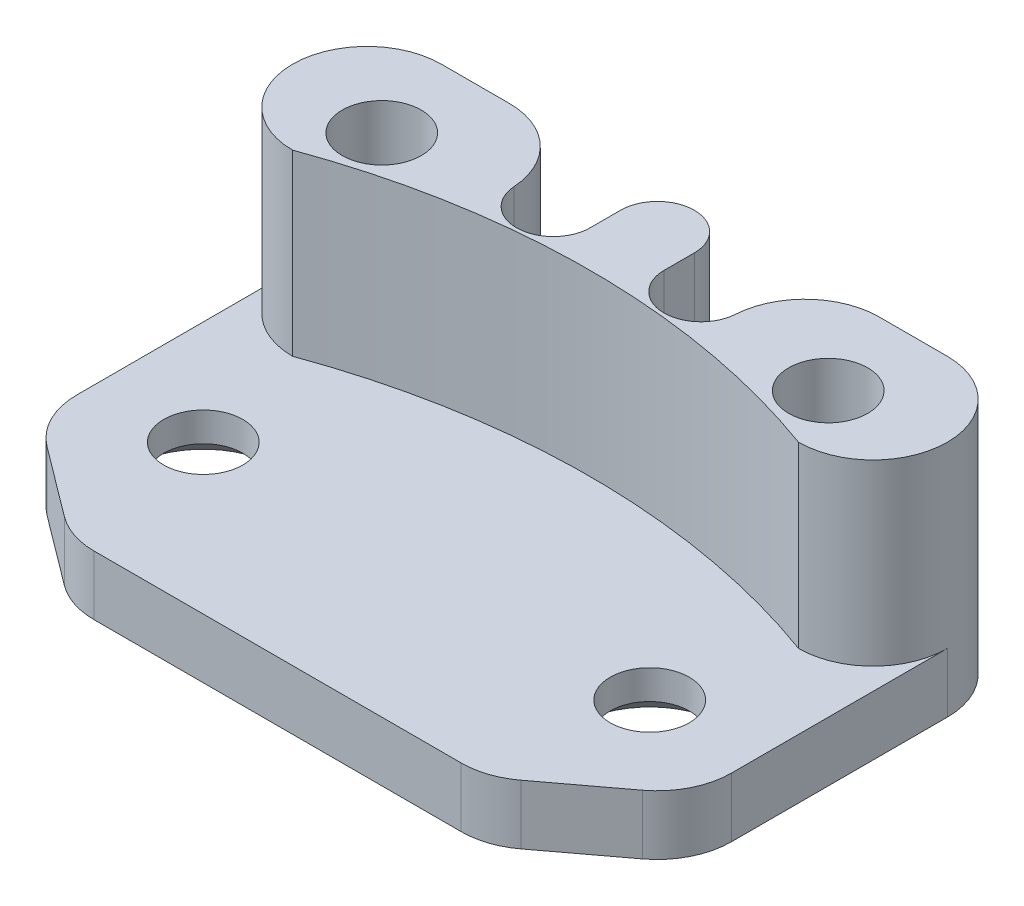
ISO-10303-21;
HEADER;
FILE_DESCRIPTION(('STEP AP214'),'2;1');
FILE_NAME('part.step','',(''),(''),'','','');
FILE_SCHEMA(('AUTOMOTIVE_DESIGN { 1 0 10303 214 1 1 1 1 }'));
ENDSEC;
DATA;
#1=APPLICATION_CONTEXT('core data for automotive mechanical design processes');
#2=APPLICATION_PROTOCOL_DEFINITION('international standard','automotive_design',2000,#1);
#3=PRODUCT_CONTEXT('',#1,'mechanical');
#4=PRODUCT('Part','Part','',(#3));
#5=PRODUCT_RELATED_PRODUCT_CATEGORY('part','',(#4));
#6=PRODUCT_DEFINITION_FORMATION('','',#4);
#7=PRODUCT_DEFINITION_CONTEXT('part definition',#1,'design');
#8=PRODUCT_DEFINITION('design','',#6,#7);
#9=PRODUCT_DEFINITION_SHAPE('','',#8);
#10=(LENGTH_UNIT() NAMED_UNIT(*) SI_UNIT(.MILLI.,.METRE.));
#11=(NAMED_UNIT(*) PLANE_ANGLE_UNIT() SI_UNIT($,.RADIAN.));
#12=(NAMED_UNIT(*) SI_UNIT($,.STERADIAN.) SOLID_ANGLE_UNIT());
#13=UNCERTAINTY_MEASURE_WITH_UNIT(LENGTH_MEASURE(1.E-05),#10,'distance_accuracy_value','');
#14=(GEOMETRIC_REPRESENTATION_CONTEXT(3) GLOBAL_UNCERTAINTY_ASSIGNED_CONTEXT((#13)) GLOBAL_UNIT_ASSIGNED_CONTEXT((#10,
#11,#12)) REPRESENTATION_CONTEXT('',''));
#15=CARTESIAN_POINT('',(0.,0.,0.));
#16=DIRECTION('',(0.,0.,1.));
#17=DIRECTION('',(1.,0.,0.));
#18=AXIS2_PLACEMENT_3D('',#15,#16,#17);
#19=CARTESIAN_POINT('',(-34.925,25.4,6.35));
#20=DIRECTION('',(1.,0.,0.));
#21=DIRECTION('',(0.,0.,-1.));
#22=AXIS2_PLACEMENT_3D('',#19,#20,#21);
#23=PLANE('',#22);
#24=DIRECTION('',(0.,0.,1.));
#25=VECTOR('',#24,1.);
#26=CARTESIAN_POINT('',(-34.925,6.35,-20.6375));
#27=LINE('',#26,#25);
#28=CARTESIAN_POINT('',(-34.925,6.35,-20.6375));
#29=VERTEX_POINT('',#28);
#30=CARTESIAN_POINT('',(-34.925,6.35,2.38125));
#31=VERTEX_POINT('',#30);
#32=EDGE_CURVE('E235',#29,#31,#27,.T.);
#33=ORIENTED_EDGE('',*,*,#32,.F.);
#34=DIRECTION('',(0.,-1.,0.));
#35=VECTOR('',#34,1.);
#36=CARTESIAN_POINT('',(-34.925,25.4,-20.6375));
#37=LINE('',#36,#35);
#38=CARTESIAN_POINT('',(-34.925,0.,-20.6375));
#39=VERTEX_POINT('',#38);
#40=EDGE_CURVE('E248',#29,#39,#37,.T.);
#41=ORIENTED_EDGE('',*,*,#40,.T.);
#42=DIRECTION('',(0.,0.,1.));
#43=VECTOR('',#42,1.);
#44=CARTESIAN_POINT('',(-34.925,0.,6.35));
#45=LINE('',#44,#43);
#46=CARTESIAN_POINT('',(-34.925,0.,2.38125));
#47=VERTEX_POINT('',#46);
#48=EDGE_CURVE('E292',#39,#47,#45,.T.);
#49=ORIENTED_EDGE('',*,*,#48,.T.);
#50=DIRECTION('',(0.,-1.,0.));
#51=VECTOR('',#50,1.);
#52=CARTESIAN_POINT('',(-34.925,25.4,2.38125));
#53=LINE('',#52,#51);
#54=EDGE_CURVE('E251',#47,#31,#53,.F.);
#55=ORIENTED_EDGE('',*,*,#54,.T.);
#56=EDGE_LOOP('',(#33,#41,#49,#55));
#57=FACE_BOUND('',#56,.T.);
#58=ADVANCED_FACE('F61',(#57),#23,.F.);
#59=CARTESIAN_POINT('',(-34.925,25.4,6.35));
#60=DIRECTION('',(0.6,0.,-0.8));
#61=DIRECTION('',(-0.8,0.,-0.6));
#62=AXIS2_PLACEMENT_3D('',#59,#60,#61);
#63=PLANE('',#62);
#64=DIRECTION('',(0.8,0.,0.6));
#65=VECTOR('',#64,1.);
#66=CARTESIAN_POINT('',(-31.75,6.35,8.73125));
#67=LINE('',#66,#65);
#68=CARTESIAN_POINT('',(-31.75,6.35,8.73125));
#69=VERTEX_POINT('',#68);
#70=CARTESIAN_POINT('',(-24.3416666666667,6.35,14.2875));
#71=VERTEX_POINT('',#70);
#72=EDGE_CURVE('E418',#69,#71,#67,.T.);
#73=ORIENTED_EDGE('',*,*,#72,.F.);
#74=DIRECTION('',(0.,-1.,0.));
#75=VECTOR('',#74,1.);
#76=CARTESIAN_POINT('',(-31.75,25.4,8.73125));
#77=LINE('',#76,#75);
#78=CARTESIAN_POINT('',(-31.75,0.,8.73125));
#79=VERTEX_POINT('',#78);
#80=EDGE_CURVE('E262',#69,#79,#77,.T.);
#81=ORIENTED_EDGE('',*,*,#80,.T.);
#82=DIRECTION('',(0.8,0.,0.6));
#83=VECTOR('',#82,1.);
#84=CARTESIAN_POINT('',(-34.925,0.,6.35));
#85=LINE('',#84,#83);
#86=CARTESIAN_POINT('',(-24.3416666666667,0.,14.2875));
#87=VERTEX_POINT('',#86);
#88=EDGE_CURVE('E296',#79,#87,#85,.T.);
#89=ORIENTED_EDGE('',*,*,#88,.T.);
#90=DIRECTION('',(0.,-1.,0.));
#91=VECTOR('',#90,1.);
#92=CARTESIAN_POINT('',(-24.3416666666667,25.4,14.2875));
#93=LINE('',#92,#91);
#94=EDGE_CURVE('E258',#87,#71,#93,.F.);
#95=ORIENTED_EDGE('',*,*,#94,.T.);
#96=EDGE_LOOP('',(#73,#81,#89,#95));
#97=FACE_BOUND('',#96,.T.);
#98=ADVANCED_FACE('F415',(#97),#63,.F.);
#99=CARTESIAN_POINT('',(-22.225,25.4,15.875));
#100=DIRECTION('',(0.,0.,-1.));
#101=DIRECTION('',(-1.,0.,0.));
#102=AXIS2_PLACEMENT_3D('',#99,#100,#101);
#103=PLANE('',#102);
#104=DIRECTION('',(1.,0.,0.));
#105=VECTOR('',#104,1.);
#106=CARTESIAN_POINT('',(-19.5791666666667,6.35,15.875));
#107=LINE('',#106,#105);
#108=CARTESIAN_POINT('',(-19.5791666666667,6.35,15.875));
#109=VERTEX_POINT('',#108);
#110=CARTESIAN_POINT('',(19.5791666666667,6.35,15.875));
#111=VERTEX_POINT('',#110);
#112=EDGE_CURVE('E429',#109,#111,#107,.T.);
#113=ORIENTED_EDGE('',*,*,#112,.F.);
#114=DIRECTION('',(0.,-1.,0.));
#115=VECTOR('',#114,1.);
#116=CARTESIAN_POINT('',(-19.5791666666667,25.4,15.875));
#117=LINE('',#116,#115);
#118=CARTESIAN_POINT('',(-19.5791666666667,0.,15.875));
#119=VERTEX_POINT('',#118);
#120=EDGE_CURVE('E407',#109,#119,#117,.T.);
#121=ORIENTED_EDGE('',*,*,#120,.T.);
#122=DIRECTION('',(1.,0.,0.));
#123=VECTOR('',#122,1.);
#124=CARTESIAN_POINT('',(-22.225,0.,15.875));
#125=LINE('',#124,#123);
#126=CARTESIAN_POINT('',(19.5791666666667,0.,15.875));
#127=VERTEX_POINT('',#126);
#128=EDGE_CURVE('E308',#119,#127,#125,.T.);
#129=ORIENTED_EDGE('',*,*,#128,.T.);
#130=DIRECTION('',(0.,-1.,0.));
#131=VECTOR('',#130,1.);
#132=CARTESIAN_POINT('',(19.5791666666667,25.4,15.875));
#133=LINE('',#132,#131);
#134=EDGE_CURVE('E409',#127,#111,#133,.F.);
#135=ORIENTED_EDGE('',*,*,#134,.T.);
#136=EDGE_LOOP('',(#113,#121,#129,#135));
#137=FACE_BOUND('',#136,.T.);
#138=ADVANCED_FACE('F529',(#137),#103,.F.);
#139=CARTESIAN_POINT('',(34.925,25.4,6.35));
#140=DIRECTION('',(-0.6,0.,-0.8));
#141=DIRECTION('',(-0.8,0.,0.6));
#142=AXIS2_PLACEMENT_3D('',#139,#140,#141);
#143=PLANE('',#142);
#144=DIRECTION('',(0.8,0.,-0.6));
#145=VECTOR('',#144,1.);
#146=CARTESIAN_POINT('',(24.3416666666667,6.35,14.2875));
#147=LINE('',#146,#145);
#148=CARTESIAN_POINT('',(24.3416666666667,6.35,14.2875));
#149=VERTEX_POINT('',#148);
#150=CARTESIAN_POINT('',(31.75,6.35,8.73125));
#151=VERTEX_POINT('',#150);
#152=EDGE_CURVE('E437',#149,#151,#147,.T.);
#153=ORIENTED_EDGE('',*,*,#152,.F.);
#154=DIRECTION('',(0.,-1.,0.));
#155=VECTOR('',#154,1.);
#156=CARTESIAN_POINT('',(24.3416666666667,25.4,14.2875));
#157=LINE('',#156,#155);
#158=CARTESIAN_POINT('',(24.3416666666667,0.,14.2875));
#159=VERTEX_POINT('',#158);
#160=EDGE_CURVE('E393',#149,#159,#157,.T.);
#161=ORIENTED_EDGE('',*,*,#160,.T.);
#162=DIRECTION('',(0.8,0.,-0.6));
#163=VECTOR('',#162,1.);
#164=CARTESIAN_POINT('',(34.925,0.,6.35));
#165=LINE('',#164,#163);
#166=CARTESIAN_POINT('',(31.75,0.,8.73125));
#167=VERTEX_POINT('',#166);
#168=EDGE_CURVE('E311',#159,#167,#165,.T.);
#169=ORIENTED_EDGE('',*,*,#168,.T.);
#170=DIRECTION('',(0.,-1.,0.));
#171=VECTOR('',#170,1.);
#172=CARTESIAN_POINT('',(31.75,25.4,8.73125));
#173=LINE('',#172,#171);
#174=EDGE_CURVE('E395',#167,#151,#173,.F.);
#175=ORIENTED_EDGE('',*,*,#174,.T.);
#176=EDGE_LOOP('',(#153,#161,#169,#175));
#177=FACE_BOUND('',#176,.T.);
#178=ADVANCED_FACE('F630',(#177),#143,.F.);
#179=CARTESIAN_POINT('',(34.925,25.4,-28.575));
#180=DIRECTION('',(-1.,0.,0.));
#181=DIRECTION('',(0.,0.,1.));
#182=AXIS2_PLACEMENT_3D('',#179,#180,#181);
#183=PLANE('',#182);
#184=DIRECTION('',(0.,0.,-1.));
#185=VECTOR('',#184,1.);
#186=CARTESIAN_POINT('',(34.925,6.35,-20.6375));
#187=LINE('',#186,#185);
#188=CARTESIAN_POINT('',(34.925,6.35,2.38125));
#189=VERTEX_POINT('',#188);
#190=CARTESIAN_POINT('',(34.925,6.35,-20.6375));
#191=VERTEX_POINT('',#190);
#192=EDGE_CURVE('E441',#189,#191,#187,.T.);
#193=ORIENTED_EDGE('',*,*,#192,.F.);
#194=DIRECTION('',(0.,-1.,0.));
#195=VECTOR('',#194,1.);
#196=CARTESIAN_POINT('',(34.925,25.4,2.38125));
#197=LINE('',#196,#195);
#198=CARTESIAN_POINT('',(34.925,0.,2.38125));
#199=VERTEX_POINT('',#198);
#200=EDGE_CURVE('E375',#189,#199,#197,.T.);
#201=ORIENTED_EDGE('',*,*,#200,.T.);
#202=DIRECTION('',(0.,0.,-1.));
#203=VECTOR('',#202,1.);
#204=CARTESIAN_POINT('',(34.925,0.,-28.575));
#205=LINE('',#204,#203);
#206=CARTESIAN_POINT('',(34.925,0.,-20.6375));
#207=VERTEX_POINT('',#206);
#208=EDGE_CURVE('E313',#199,#207,#205,.T.);
#209=ORIENTED_EDGE('',*,*,#208,.T.);
#210=DIRECTION('',(0.,-1.,0.));
#211=VECTOR('',#210,1.);
#212=CARTESIAN_POINT('',(34.925,25.4,-20.6375));
#213=LINE('',#212,#211);
#214=EDGE_CURVE('E365',#207,#191,#213,.F.);
#215=ORIENTED_EDGE('',*,*,#214,.T.);
#216=EDGE_LOOP('',(#193,#201,#209,#215));
#217=FACE_BOUND('',#216,.T.);
#218=ADVANCED_FACE('F557',(#217),#183,.F.);
#219=CARTESIAN_POINT('',(26.9875,25.4,2.38125));
#220=DIRECTION('',(0.,-1.,0.));
#221=DIRECTION('',(0.,0.,-1.));
#222=AXIS2_PLACEMENT_3D('',#219,#220,#221);
#223=CYLINDRICAL_SURFACE('',#222,7.9375);
#224=ORIENTED_EDGE('',*,*,#200,.F.);
#225=CARTESIAN_POINT('',(26.9875,6.35,2.38125));
#226=DIRECTION('',(0.,1.,0.));
#227=DIRECTION('',(0.,0.,1.));
#228=AXIS2_PLACEMENT_3D('',#225,#226,#227);
#229=CIRCLE('',#228,7.9375);
#230=EDGE_CURVE('E439',#151,#189,#229,.T.);
#231=ORIENTED_EDGE('',*,*,#230,.F.);
#232=ORIENTED_EDGE('',*,*,#174,.F.);
#233=CARTESIAN_POINT('',(26.9875,0.,2.38125));
#234=DIRECTION('',(0.,1.,0.));
#235=DIRECTION('',(0.,0.,1.));
#236=AXIS2_PLACEMENT_3D('',#233,#234,#235);
#237=CIRCLE('',#236,7.9375);
#238=EDGE_CURVE('E391',#199,#167,#237,.F.);
#239=ORIENTED_EDGE('',*,*,#238,.F.);
#240=EDGE_LOOP('',(#224,#231,#232,#239));
#241=FACE_BOUND('',#240,.T.);
#242=ADVANCED_FACE('F553',(#241),#223,.T.);
#243=CARTESIAN_POINT('',(19.5791666666667,25.4,7.9375));
#244=DIRECTION('',(0.,-1.,0.));
#245=DIRECTION('',(0.,0.,-1.));
#246=AXIS2_PLACEMENT_3D('',#243,#244,#245);
#247=CYLINDRICAL_SURFACE('',#246,7.9375);
#248=ORIENTED_EDGE('',*,*,#160,.F.);
#249=CARTESIAN_POINT('',(19.5791666666667,6.35,7.9375));
#250=DIRECTION('',(0.,1.,0.));
#251=DIRECTION('',(0.,0.,1.));
#252=AXIS2_PLACEMENT_3D('',#249,#250,#251);
#253=CIRCLE('',#252,7.9375);
#254=EDGE_CURVE('E431',#111,#149,#253,.T.);
#255=ORIENTED_EDGE('',*,*,#254,.F.);
#256=ORIENTED_EDGE('',*,*,#134,.F.);
#257=CARTESIAN_POINT('',(19.5791666666667,0.,7.9375));
#258=DIRECTION('',(0.,1.,0.));
#259=DIRECTION('',(0.,0.,1.));
#260=AXIS2_PLACEMENT_3D('',#257,#258,#259);
#261=CIRCLE('',#260,7.9375);
#262=EDGE_CURVE('E389',#159,#127,#261,.F.);
#263=ORIENTED_EDGE('',*,*,#262,.F.);
#264=EDGE_LOOP('',(#248,#255,#256,#263));
#265=FACE_BOUND('',#264,.T.);
#266=ADVANCED_FACE('F556',(#265),#247,.T.);
#267=CARTESIAN_POINT('',(-19.5791666666667,25.4,7.9375));
#268=DIRECTION('',(0.,-1.,0.));
#269=DIRECTION('',(0.,0.,-1.));
#270=AXIS2_PLACEMENT_3D('',#267,#268,#269);
#271=CYLINDRICAL_SURFACE('',#270,7.9375);
#272=ORIENTED_EDGE('',*,*,#120,.F.);
#273=CARTESIAN_POINT('',(-19.5791666666667,6.35,7.9375));
#274=DIRECTION('',(0.,1.,0.));
#275=DIRECTION('',(0.,0.,1.));
#276=AXIS2_PLACEMENT_3D('',#273,#274,#275);
#277=CIRCLE('',#276,7.9375);
#278=EDGE_CURVE('E427',#71,#109,#277,.T.);
#279=ORIENTED_EDGE('',*,*,#278,.F.);
#280=ORIENTED_EDGE('',*,*,#94,.F.);
#281=CARTESIAN_POINT('',(-19.5791666666667,0.,7.9375));
#282=DIRECTION('',(0.,1.,0.));
#283=DIRECTION('',(0.,0.,1.));
#284=AXIS2_PLACEMENT_3D('',#281,#282,#283);
#285=CIRCLE('',#284,7.9375);
#286=EDGE_CURVE('E387',#119,#87,#285,.F.);
#287=ORIENTED_EDGE('',*,*,#286,.F.);
#288=EDGE_LOOP('',(#272,#279,#280,#287));
#289=FACE_BOUND('',#288,.T.);
#290=ADVANCED_FACE('F425',(#289),#271,.T.);
#291=CARTESIAN_POINT('',(-26.9875,25.4,2.38125));
#292=DIRECTION('',(0.,-1.,0.));
#293=DIRECTION('',(0.,0.,-1.));
#294=AXIS2_PLACEMENT_3D('',#291,#292,#293);
#295=CYLINDRICAL_SURFACE('',#294,7.9375);
#296=ORIENTED_EDGE('',*,*,#80,.F.);
#297=CARTESIAN_POINT('',(-26.9875,6.35,2.38125));
#298=DIRECTION('',(0.,1.,0.));
#299=DIRECTION('',(0.,0.,1.));
#300=AXIS2_PLACEMENT_3D('',#297,#298,#299);
#301=CIRCLE('',#300,7.9375);
#302=EDGE_CURVE('E252',#31,#69,#301,.T.);
#303=ORIENTED_EDGE('',*,*,#302,.F.);
#304=ORIENTED_EDGE('',*,*,#54,.F.);
#305=CARTESIAN_POINT('',(-26.9875,0.,2.38125));
#306=DIRECTION('',(0.,1.,0.));
#307=DIRECTION('',(0.,0.,1.));
#308=AXIS2_PLACEMENT_3D('',#305,#306,#307);
#309=CIRCLE('',#308,7.9375);
#310=EDGE_CURVE('E384',#79,#47,#309,.F.);
#311=ORIENTED_EDGE('',*,*,#310,.F.);
#312=EDGE_LOOP('',(#296,#303,#304,#311));
#313=FACE_BOUND('',#312,.T.);
#314=ADVANCED_FACE('F420',(#313),#295,.T.);
#315=CARTESIAN_POINT('',(-23.8125,0.,0.));
#316=DIRECTION('',(0.,-1.,0.));
#317=DIRECTION('',(0.,0.,-1.));
#318=AXIS2_PLACEMENT_3D('',#315,#316,#317);
#319=CYLINDRICAL_SURFACE('',#318,4.21639999999999);
#320=CARTESIAN_POINT('',(-23.8125,3.2289392907333,0.));
#321=DIRECTION('',(0.,-1.,0.));
#322=DIRECTION('',(0.,0.,-1.));
#323=AXIS2_PLACEMENT_3D('',#320,#321,#322);
#324=CIRCLE('',#323,4.21639999999999);
#325=CARTESIAN_POINT('',(-23.8125,3.2289392907333,-4.21639999999999));
#326=VERTEX_POINT('',#325);
#327=EDGE_CURVE('E466',#326,#326,#324,.T.);
#328=ORIENTED_EDGE('',*,*,#327,.T.);
#329=EDGE_LOOP('',(#328));
#330=FACE_BOUND('',#329,.T.);
#331=CARTESIAN_POINT('',(-23.8125,6.35,0.));
#332=DIRECTION('',(0.,1.,0.));
#333=DIRECTION('',(0.,0.,1.));
#334=AXIS2_PLACEMENT_3D('',#331,#332,#333);
#335=CIRCLE('',#334,4.21639999999999);
#336=CARTESIAN_POINT('',(-23.8125,6.35,4.21639999999999));
#337=VERTEX_POINT('',#336);
#338=EDGE_CURVE('E582',#337,#337,#335,.F.);
#339=ORIENTED_EDGE('',*,*,#338,.F.);
#340=EDGE_LOOP('',(#339));
#341=FACE_BOUND('',#340,.T.);
#342=ADVANCED_FACE('F566',(#330,#341),#319,.F.);
#343=CARTESIAN_POINT('',(23.8125,0.,0.));
#344=DIRECTION('',(0.,-1.,0.));
#345=DIRECTION('',(0.,0.,-1.));
#346=AXIS2_PLACEMENT_3D('',#343,#344,#345);
#347=CYLINDRICAL_SURFACE('',#346,4.21639999999999);
#348=CARTESIAN_POINT('',(23.8125,3.2289392907333,0.));
#349=DIRECTION('',(0.,-1.,0.));
#350=DIRECTION('',(0.,0.,-1.));
#351=AXIS2_PLACEMENT_3D('',#348,#349,#350);
#352=CIRCLE('',#351,4.21639999999999);
#353=CARTESIAN_POINT('',(23.8125,3.2289392907333,-4.21639999999999));
#354=VERTEX_POINT('',#353);
#355=EDGE_CURVE('E453',#354,#354,#352,.T.);
#356=ORIENTED_EDGE('',*,*,#355,.T.);
#357=EDGE_LOOP('',(#356));
#358=FACE_BOUND('',#357,.T.);
#359=CARTESIAN_POINT('',(23.8125,6.35,0.));
#360=DIRECTION('',(0.,1.,0.));
#361=DIRECTION('',(0.,0.,1.));
#362=AXIS2_PLACEMENT_3D('',#359,#360,#361);
#363=CIRCLE('',#362,4.21639999999999);
#364=CARTESIAN_POINT('',(23.8125,6.35,4.21639999999999));
#365=VERTEX_POINT('',#364);
#366=EDGE_CURVE('E65',#365,#365,#363,.F.);
#367=ORIENTED_EDGE('',*,*,#366,.F.);
#368=EDGE_LOOP('',(#367));
#369=FACE_BOUND('',#368,.T.);
#370=ADVANCED_FACE('F593',(#358,#369),#347,.F.);
#371=CARTESIAN_POINT('',(0.,25.4,0.));
#372=DIRECTION('',(0.,1.,0.));
#373=DIRECTION('',(0.,0.,1.));
#374=AXIS2_PLACEMENT_3D('',#371,#372,#373);
#375=PLANE('',#374);
#376=CARTESIAN_POINT('',(-26.9875,25.4,-20.6375));
#377=DIRECTION('',(0.,1.,0.));
#378=DIRECTION('',(0.,0.,1.));
#379=AXIS2_PLACEMENT_3D('',#376,#377,#378);
#380=CIRCLE('',#379,7.9375);
#381=CARTESIAN_POINT('',(-26.9875,25.4,-28.575));
#382=VERTEX_POINT('',#381);
#383=CARTESIAN_POINT('',(-26.9875,25.4,-12.7));
#384=VERTEX_POINT('',#383);
#385=EDGE_CURVE('E398',#382,#384,#380,.T.);
#386=ORIENTED_EDGE('',*,*,#385,.T.);
#387=CARTESIAN_POINT('',(0.,25.4,61.3833333333333));
#388=DIRECTION('',(0.,1.,0.));
#389=DIRECTION('',(0.,0.,-1.));
#390=AXIS2_PLACEMENT_3D('',#387,#388,#389);
#391=CIRCLE('',#390,78.8458333333333);
#392=CARTESIAN_POINT('',(26.9875,25.4,-12.7));
#393=VERTEX_POINT('',#392);
#394=EDGE_CURVE('E243',#393,#384,#391,.T.);
#395=ORIENTED_EDGE('',*,*,#394,.F.);
#396=CARTESIAN_POINT('',(26.9875,25.4,-20.6375));
#397=DIRECTION('',(0.,1.,0.));
#398=DIRECTION('',(0.,0.,1.));
#399=AXIS2_PLACEMENT_3D('',#396,#397,#398);
#400=CIRCLE('',#399,7.9375);
#401=CARTESIAN_POINT('',(26.9875,25.4,-28.575));
#402=VERTEX_POINT('',#401);
#403=EDGE_CURVE('E404',#393,#402,#400,.T.);
#404=ORIENTED_EDGE('',*,*,#403,.T.);
#405=DIRECTION('',(-1.,0.,0.));
#406=VECTOR('',#405,1.);
#407=CARTESIAN_POINT('',(11.811,25.4,-28.575));
#408=LINE('',#407,#406);
#409=CARTESIAN_POINT('',(19.7240255801412,25.4,-28.575));
#410=VERTEX_POINT('',#409);
#411=EDGE_CURVE('E485',#402,#410,#408,.T.);
#412=ORIENTED_EDGE('',*,*,#411,.T.);
#413=CARTESIAN_POINT('',(19.7240255801412,25.4,-20.6375));
#414=DIRECTION('',(0.,1.,0.));
#415=DIRECTION('',(0.,0.,1.));
#416=AXIS2_PLACEMENT_3D('',#413,#414,#415);
#417=CIRCLE('',#416,7.9375);
#418=CARTESIAN_POINT('',(11.8028854864639,25.4,-21.1468582887701));
#419=VERTEX_POINT('',#418);
#420=EDGE_CURVE('E78',#410,#419,#417,.T.);
#421=ORIENTED_EDGE('',*,*,#420,.T.);
#422=CARTESIAN_POINT('',(7.874,25.4,-21.3995));
#423=DIRECTION('',(0.,1.,0.));
#424=DIRECTION('',(0.,0.,1.));
#425=AXIS2_PLACEMENT_3D('',#422,#423,#424);
#426=CIRCLE('',#425,3.937);
#427=CARTESIAN_POINT('',(7.874,25.4,-17.4625));
#428=VERTEX_POINT('',#427);
#429=EDGE_CURVE('E348',#419,#428,#426,.F.);
#430=ORIENTED_EDGE('',*,*,#429,.T.);
#431=CARTESIAN_POINT('',(7.874,25.4,-21.3995));
#432=DIRECTION('',(0.,1.,0.));
#433=DIRECTION('',(0.,0.,1.));
#434=AXIS2_PLACEMENT_3D('',#431,#432,#433);
#435=CIRCLE('',#434,3.937);
#436=CARTESIAN_POINT('',(3.937,25.4,-21.3995));
#437=VERTEX_POINT('',#436);
#438=EDGE_CURVE('E352',#428,#437,#435,.F.);
#439=ORIENTED_EDGE('',*,*,#438,.T.);
#440=DIRECTION('',(0.,0.,-1.));
#441=VECTOR('',#440,1.);
#442=CARTESIAN_POINT('',(3.937,25.4,-28.575));
#443=LINE('',#442,#441);
#444=CARTESIAN_POINT('',(3.937,25.4,-24.638));
#445=VERTEX_POINT('',#444);
#446=EDGE_CURVE('E486',#437,#445,#443,.T.);
#447=ORIENTED_EDGE('',*,*,#446,.T.);
#448=CARTESIAN_POINT('',(0.,25.4,-24.638));
#449=DIRECTION('',(0.,1.,0.));
#450=DIRECTION('',(0.,0.,1.));
#451=AXIS2_PLACEMENT_3D('',#448,#449,#450);
#452=CIRCLE('',#451,3.937);
#453=CARTESIAN_POINT('',(0.,25.4,-28.575));
#454=VERTEX_POINT('',#453);
#455=EDGE_CURVE('E338',#445,#454,#452,.T.);
#456=ORIENTED_EDGE('',*,*,#455,.T.);
#457=CARTESIAN_POINT('',(0.,25.4,-24.638));
#458=DIRECTION('',(0.,1.,0.));
#459=DIRECTION('',(0.,0.,1.));
#460=AXIS2_PLACEMENT_3D('',#457,#458,#459);
#461=CIRCLE('',#460,3.937);
#462=CARTESIAN_POINT('',(-3.937,25.4,-24.638));
#463=VERTEX_POINT('',#462);
#464=EDGE_CURVE('E336',#454,#463,#461,.T.);
#465=ORIENTED_EDGE('',*,*,#464,.T.);
#466=DIRECTION('',(0.,0.,1.));
#467=VECTOR('',#466,1.);
#468=CARTESIAN_POINT('',(-3.937,25.4,-17.4625));
#469=LINE('',#468,#467);
#470=CARTESIAN_POINT('',(-3.937,25.4,-21.3995));
#471=VERTEX_POINT('',#470);
#472=EDGE_CURVE('E303',#463,#471,#469,.T.);
#473=ORIENTED_EDGE('',*,*,#472,.T.);
#474=CARTESIAN_POINT('',(-7.874,25.4,-21.3995));
#475=DIRECTION('',(0.,1.,0.));
#476=DIRECTION('',(0.,0.,1.));
#477=AXIS2_PLACEMENT_3D('',#474,#475,#476);
#478=CIRCLE('',#477,3.937);
#479=CARTESIAN_POINT('',(-7.874,25.4,-17.4625));
#480=VERTEX_POINT('',#479);
#481=EDGE_CURVE('E358',#471,#480,#478,.F.);
#482=ORIENTED_EDGE('',*,*,#481,.T.);
#483=CARTESIAN_POINT('',(-7.874,25.4,-21.3995));
#484=DIRECTION('',(0.,1.,0.));
#485=DIRECTION('',(0.,0.,1.));
#486=AXIS2_PLACEMENT_3D('',#483,#484,#485);
#487=CIRCLE('',#486,3.937);
#488=CARTESIAN_POINT('',(-11.8028854864639,25.4,-21.1468582887701));
#489=VERTEX_POINT('',#488);
#490=EDGE_CURVE('E363',#480,#489,#487,.F.);
#491=ORIENTED_EDGE('',*,*,#490,.T.);
#492=CARTESIAN_POINT('',(-19.7240255801412,25.4,-20.6375));
#493=DIRECTION('',(0.,1.,0.));
#494=DIRECTION('',(0.,0.,1.));
#495=AXIS2_PLACEMENT_3D('',#492,#493,#494);
#496=CIRCLE('',#495,7.9375);
#497=CARTESIAN_POINT('',(-19.7240255801412,25.4,-28.575));
#498=VERTEX_POINT('',#497);
#499=EDGE_CURVE('E400',#489,#498,#496,.T.);
#500=ORIENTED_EDGE('',*,*,#499,.T.);
#501=DIRECTION('',(-1.,0.,0.));
#502=VECTOR('',#501,1.);
#503=CARTESIAN_POINT('',(-34.925,25.4,-28.575));
#504=LINE('',#503,#502);
#505=EDGE_CURVE('E284',#498,#382,#504,.T.);
#506=ORIENTED_EDGE('',*,*,#505,.T.);
#507=EDGE_LOOP('',(#386,#395,#404,#412,#421,#430,#439,#447,#456,#465,#473,#482,#491,#500,#506));
#508=FACE_BOUND('',#507,.T.);
#509=CARTESIAN_POINT('',(23.7998,25.4,-19.05));
#510=DIRECTION('',(0.,1.,0.));
#511=DIRECTION('',(0.,0.,1.));
#512=AXIS2_PLACEMENT_3D('',#509,#510,#511);
#513=CIRCLE('',#512,4.2164);
#514=CARTESIAN_POINT('',(23.7998,25.4,-14.8336));
#515=VERTEX_POINT('',#514);
#516=EDGE_CURVE('E479',#515,#515,#513,.T.);
#517=ORIENTED_EDGE('',*,*,#516,.F.);
#518=EDGE_LOOP('',(#517));
#519=FACE_BOUND('',#518,.T.);
#520=CARTESIAN_POINT('',(-23.8252,25.4,-19.05));
#521=DIRECTION('',(0.,1.,0.));
#522=DIRECTION('',(0.,0.,1.));
#523=AXIS2_PLACEMENT_3D('',#520,#521,#522);
#524=CIRCLE('',#523,4.2164);
#525=CARTESIAN_POINT('',(-23.8252,25.4,-14.8336));
#526=VERTEX_POINT('',#525);
#527=EDGE_CURVE('E472',#526,#526,#524,.T.);
#528=ORIENTED_EDGE('',*,*,#527,.F.);
#529=EDGE_LOOP('',(#528));
#530=FACE_BOUND('',#529,.T.);
#531=ADVANCED_FACE('F491',(#508,#519,#530),#375,.T.);
#532=CARTESIAN_POINT('',(-34.925,25.4,-28.575));
#533=DIRECTION('',(0.,0.,1.));
#534=DIRECTION('',(1.,0.,0.));
#535=AXIS2_PLACEMENT_3D('',#532,#533,#534);
#536=PLANE('',#535);
#537=ORIENTED_EDGE('',*,*,#505,.F.);
#538=DIRECTION('',(0.,1.,0.));
#539=VECTOR('',#538,1.);
#540=CARTESIAN_POINT('',(-19.7240255801412,25.4,-28.575));
#541=LINE('',#540,#539);
#542=CARTESIAN_POINT('',(-19.7240255801412,0.,-28.575));
#543=VERTEX_POINT('',#542);
#544=EDGE_CURVE('E71',#498,#543,#541,.F.);
#545=ORIENTED_EDGE('',*,*,#544,.T.);
#546=DIRECTION('',(-1.,0.,0.));
#547=VECTOR('',#546,1.);
#548=CARTESIAN_POINT('',(-34.925,0.,-28.575));
#549=LINE('',#548,#547);
#550=CARTESIAN_POINT('',(-26.9875,0.,-28.575));
#551=VERTEX_POINT('',#550);
#552=EDGE_CURVE('E282',#543,#551,#549,.T.);
#553=ORIENTED_EDGE('',*,*,#552,.T.);
#554=DIRECTION('',(0.,-1.,0.));
#555=VECTOR('',#554,1.);
#556=CARTESIAN_POINT('',(-26.9875,25.4,-28.575));
#557=LINE('',#556,#555);
#558=EDGE_CURVE('E273',#551,#382,#557,.F.);
#559=ORIENTED_EDGE('',*,*,#558,.T.);
#560=EDGE_LOOP('',(#537,#545,#553,#559));
#561=FACE_BOUND('',#560,.T.);
#562=ADVANCED_FACE('F281',(#561),#536,.F.);
#563=CARTESIAN_POINT('',(11.811,25.4,-28.575));
#564=DIRECTION('',(0.,0.,1.));
#565=DIRECTION('',(1.,0.,0.));
#566=AXIS2_PLACEMENT_3D('',#563,#564,#565);
#567=PLANE('',#566);
#568=ORIENTED_EDGE('',*,*,#411,.F.);
#569=DIRECTION('',(0.,-1.,0.));
#570=VECTOR('',#569,1.);
#571=CARTESIAN_POINT('',(26.9875,25.4,-28.575));
#572=LINE('',#571,#570);
#573=CARTESIAN_POINT('',(26.9875,0.,-28.575));
#574=VERTEX_POINT('',#573);
#575=EDGE_CURVE('E267',#402,#574,#572,.T.);
#576=ORIENTED_EDGE('',*,*,#575,.T.);
#577=DIRECTION('',(-1.,0.,0.));
#578=VECTOR('',#577,1.);
#579=CARTESIAN_POINT('',(11.811,0.,-28.575));
#580=LINE('',#579,#578);
#581=CARTESIAN_POINT('',(19.7240255801412,0.,-28.575));
#582=VERTEX_POINT('',#581);
#583=EDGE_CURVE('E318',#574,#582,#580,.T.);
#584=ORIENTED_EDGE('',*,*,#583,.T.);
#585=DIRECTION('',(0.,1.,0.));
#586=VECTOR('',#585,1.);
#587=CARTESIAN_POINT('',(19.7240255801412,25.4,-28.575));
#588=LINE('',#587,#586);
#589=EDGE_CURVE('E86',#582,#410,#588,.T.);
#590=ORIENTED_EDGE('',*,*,#589,.T.);
#591=EDGE_LOOP('',(#568,#576,#584,#590));
#592=FACE_BOUND('',#591,.T.);
#593=ADVANCED_FACE('F535',(#592),#567,.F.);
#594=CARTESIAN_POINT('',(3.937,25.4,-28.575));
#595=DIRECTION('',(-1.,0.,0.));
#596=DIRECTION('',(0.,0.,1.));
#597=AXIS2_PLACEMENT_3D('',#594,#595,#596);
#598=PLANE('',#597);
#599=ORIENTED_EDGE('',*,*,#446,.F.);
#600=DIRECTION('',(0.,-1.,0.));
#601=VECTOR('',#600,1.);
#602=CARTESIAN_POINT('',(3.937,0.,-21.3995));
#603=LINE('',#602,#601);
#604=CARTESIAN_POINT('',(3.937,0.,-21.3995));
#605=VERTEX_POINT('',#604);
#606=EDGE_CURVE('E330',#437,#605,#603,.T.);
#607=ORIENTED_EDGE('',*,*,#606,.T.);
#608=DIRECTION('',(0.,0.,-1.));
#609=VECTOR('',#608,1.);
#610=CARTESIAN_POINT('',(3.937,0.,-28.575));
#611=LINE('',#610,#609);
#612=CARTESIAN_POINT('',(3.937,0.,-24.638));
#613=VERTEX_POINT('',#612);
#614=EDGE_CURVE('E321',#605,#613,#611,.T.);
#615=ORIENTED_EDGE('',*,*,#614,.T.);
#616=DIRECTION('',(0.,-1.,0.));
#617=VECTOR('',#616,1.);
#618=CARTESIAN_POINT('',(3.937,25.4,-24.638));
#619=LINE('',#618,#617);
#620=EDGE_CURVE('E327',#613,#445,#619,.F.);
#621=ORIENTED_EDGE('',*,*,#620,.T.);
#622=EDGE_LOOP('',(#599,#607,#615,#621));
#623=FACE_BOUND('',#622,.T.);
#624=ADVANCED_FACE('F622',(#623),#598,.F.);
#625=CARTESIAN_POINT('',(-3.937,25.4,-17.4625));
#626=DIRECTION('',(1.,0.,0.));
#627=DIRECTION('',(0.,0.,-1.));
#628=AXIS2_PLACEMENT_3D('',#625,#626,#627);
#629=PLANE('',#628);
#630=ORIENTED_EDGE('',*,*,#472,.F.);
#631=DIRECTION('',(0.,-1.,0.));
#632=VECTOR('',#631,1.);
#633=CARTESIAN_POINT('',(-3.937,25.4,-24.638));
#634=LINE('',#633,#632);
#635=CARTESIAN_POINT('',(-3.937,0.,-24.638));
#636=VERTEX_POINT('',#635);
#637=EDGE_CURVE('E343',#463,#636,#634,.T.);
#638=ORIENTED_EDGE('',*,*,#637,.T.);
#639=DIRECTION('',(0.,0.,1.));
#640=VECTOR('',#639,1.);
#641=CARTESIAN_POINT('',(-3.937,0.,-17.4625));
#642=LINE('',#641,#640);
#643=CARTESIAN_POINT('',(-3.937,0.,-21.3995));
#644=VERTEX_POINT('',#643);
#645=EDGE_CURVE('E324',#636,#644,#642,.T.);
#646=ORIENTED_EDGE('',*,*,#645,.T.);
#647=DIRECTION('',(0.,-1.,0.));
#648=VECTOR('',#647,1.);
#649=CARTESIAN_POINT('',(-3.937,25.4,-21.3995));
#650=LINE('',#649,#648);
#651=EDGE_CURVE('E340',#644,#471,#650,.F.);
#652=ORIENTED_EDGE('',*,*,#651,.T.);
#653=EDGE_LOOP('',(#630,#638,#646,#652));
#654=FACE_BOUND('',#653,.T.);
#655=ADVANCED_FACE('F497',(#654),#629,.F.);
#656=CARTESIAN_POINT('',(0.,0.,0.));
#657=DIRECTION('',(0.,1.,0.));
#658=DIRECTION('',(0.,0.,1.));
#659=AXIS2_PLACEMENT_3D('',#656,#657,#658);
#660=PLANE('',#659);
#661=CARTESIAN_POINT('',(23.8125,0.,0.));
#662=DIRECTION('',(0.,-1.,0.));
#663=DIRECTION('',(0.,0.,-1.));
#664=AXIS2_PLACEMENT_3D('',#661,#662,#663);
#665=CIRCLE('',#664,8.0645);
#666=CARTESIAN_POINT('',(23.8125,0.,-8.0645));
#667=VERTEX_POINT('',#666);
#668=EDGE_CURVE('E459',#667,#667,#665,.T.);
#669=ORIENTED_EDGE('',*,*,#668,.F.);
#670=EDGE_LOOP('',(#669));
#671=FACE_BOUND('',#670,.T.);
#672=CARTESIAN_POINT('',(-23.8125,0.,0.));
#673=DIRECTION('',(0.,-1.,0.));
#674=DIRECTION('',(0.,0.,-1.));
#675=AXIS2_PLACEMENT_3D('',#672,#673,#674);
#676=CIRCLE('',#675,8.0645);
#677=CARTESIAN_POINT('',(-23.8125,0.,-8.06450000000001));
#678=VERTEX_POINT('',#677);
#679=EDGE_CURVE('E458',#678,#678,#676,.T.);
#680=ORIENTED_EDGE('',*,*,#679,.F.);
#681=EDGE_LOOP('',(#680));
#682=FACE_BOUND('',#681,.T.);
#683=CARTESIAN_POINT('',(-23.8252,0.,-19.05));
#684=DIRECTION('',(0.,1.,0.));
#685=DIRECTION('',(0.,0.,1.));
#686=AXIS2_PLACEMENT_3D('',#683,#684,#685);
#687=CIRCLE('',#686,4.21639999999999);
#688=CARTESIAN_POINT('',(-23.8252,0.,-14.8336));
#689=VERTEX_POINT('',#688);
#690=EDGE_CURVE('E475',#689,#689,#687,.T.);
#691=ORIENTED_EDGE('',*,*,#690,.T.);
#692=EDGE_LOOP('',(#691));
#693=FACE_BOUND('',#692,.T.);
#694=CARTESIAN_POINT('',(23.7998,0.,-19.05));
#695=DIRECTION('',(0.,1.,0.));
#696=DIRECTION('',(0.,0.,1.));
#697=AXIS2_PLACEMENT_3D('',#694,#695,#696);
#698=CIRCLE('',#697,4.21639999999999);
#699=CARTESIAN_POINT('',(23.7998,0.,-14.8336));
#700=VERTEX_POINT('',#699);
#701=EDGE_CURVE('E372',#700,#700,#698,.T.);
#702=ORIENTED_EDGE('',*,*,#701,.T.);
#703=EDGE_LOOP('',(#702));
#704=FACE_BOUND('',#703,.T.);
#705=ORIENTED_EDGE('',*,*,#208,.F.);
#706=ORIENTED_EDGE('',*,*,#238,.T.);
#707=ORIENTED_EDGE('',*,*,#168,.F.);
#708=ORIENTED_EDGE('',*,*,#262,.T.);
#709=ORIENTED_EDGE('',*,*,#128,.F.);
#710=ORIENTED_EDGE('',*,*,#286,.T.);
#711=ORIENTED_EDGE('',*,*,#88,.F.);
#712=ORIENTED_EDGE('',*,*,#310,.T.);
#713=ORIENTED_EDGE('',*,*,#48,.F.);
#714=CARTESIAN_POINT('',(-26.9875,0.,-20.6375));
#715=DIRECTION('',(0.,1.,0.));
#716=DIRECTION('',(0.,0.,1.));
#717=AXIS2_PLACEMENT_3D('',#714,#715,#716);
#718=CIRCLE('',#717,7.9375);
#719=EDGE_CURVE('E256',#39,#551,#718,.F.);
#720=ORIENTED_EDGE('',*,*,#719,.T.);
#721=ORIENTED_EDGE('',*,*,#552,.F.);
#722=CARTESIAN_POINT('',(-19.7240255801412,0.,-20.6375));
#723=DIRECTION('',(0.,1.,0.));
#724=DIRECTION('',(0.,0.,1.));
#725=AXIS2_PLACEMENT_3D('',#722,#723,#724);
#726=CIRCLE('',#725,7.9375);
#727=CARTESIAN_POINT('',(-11.8028854864639,0.,-21.1468582887701));
#728=VERTEX_POINT('',#727);
#729=EDGE_CURVE('E290',#543,#728,#726,.F.);
#730=ORIENTED_EDGE('',*,*,#729,.T.);
#731=CARTESIAN_POINT('',(-7.874,0.,-21.3995));
#732=DIRECTION('',(0.,1.,0.));
#733=DIRECTION('',(0.,0.,1.));
#734=AXIS2_PLACEMENT_3D('',#731,#732,#733);
#735=CIRCLE('',#734,3.937);
#736=CARTESIAN_POINT('',(-7.874,0.,-17.4625));
#737=VERTEX_POINT('',#736);
#738=EDGE_CURVE('E360',#728,#737,#735,.T.);
#739=ORIENTED_EDGE('',*,*,#738,.T.);
#740=CARTESIAN_POINT('',(-7.874,0.,-21.3995));
#741=DIRECTION('',(0.,1.,0.));
#742=DIRECTION('',(0.,0.,1.));
#743=AXIS2_PLACEMENT_3D('',#740,#741,#742);
#744=CIRCLE('',#743,3.937);
#745=EDGE_CURVE('E355',#737,#644,#744,.T.);
#746=ORIENTED_EDGE('',*,*,#745,.T.);
#747=ORIENTED_EDGE('',*,*,#645,.F.);
#748=CARTESIAN_POINT('',(0.,0.,-24.638));
#749=DIRECTION('',(0.,1.,0.));
#750=DIRECTION('',(0.,0.,1.));
#751=AXIS2_PLACEMENT_3D('',#748,#749,#750);
#752=CIRCLE('',#751,3.937);
#753=CARTESIAN_POINT('',(0.,0.,-28.575));
#754=VERTEX_POINT('',#753);
#755=EDGE_CURVE('E332',#636,#754,#752,.F.);
#756=ORIENTED_EDGE('',*,*,#755,.T.);
#757=CARTESIAN_POINT('',(0.,0.,-24.638));
#758=DIRECTION('',(0.,1.,0.));
#759=DIRECTION('',(0.,0.,1.));
#760=AXIS2_PLACEMENT_3D('',#757,#758,#759);
#761=CIRCLE('',#760,3.937);
#762=EDGE_CURVE('E334',#754,#613,#761,.F.);
#763=ORIENTED_EDGE('',*,*,#762,.T.);
#764=ORIENTED_EDGE('',*,*,#614,.F.);
#765=CARTESIAN_POINT('',(7.874,0.,-21.3995));
#766=DIRECTION('',(0.,1.,0.));
#767=DIRECTION('',(0.,0.,1.));
#768=AXIS2_PLACEMENT_3D('',#765,#766,#767);
#769=CIRCLE('',#768,3.937);
#770=CARTESIAN_POINT('',(7.874,0.,-17.4625));
#771=VERTEX_POINT('',#770);
#772=EDGE_CURVE('E350',#605,#771,#769,.T.);
#773=ORIENTED_EDGE('',*,*,#772,.T.);
#774=CARTESIAN_POINT('',(7.874,0.,-21.3995));
#775=DIRECTION('',(0.,1.,0.));
#776=DIRECTION('',(0.,0.,1.));
#777=AXIS2_PLACEMENT_3D('',#774,#775,#776);
#778=CIRCLE('',#777,3.937);
#779=CARTESIAN_POINT('',(11.8028854864639,0.,-21.1468582887701));
#780=VERTEX_POINT('',#779);
#781=EDGE_CURVE('E345',#771,#780,#778,.T.);
#782=ORIENTED_EDGE('',*,*,#781,.T.);
#783=CARTESIAN_POINT('',(19.7240255801412,0.,-20.6375));
#784=DIRECTION('',(0.,1.,0.));
#785=DIRECTION('',(0.,0.,1.));
#786=AXIS2_PLACEMENT_3D('',#783,#784,#785);
#787=CIRCLE('',#786,7.9375);
#788=EDGE_CURVE('E379',#780,#582,#787,.F.);
#789=ORIENTED_EDGE('',*,*,#788,.T.);
#790=ORIENTED_EDGE('',*,*,#583,.F.);
#791=CARTESIAN_POINT('',(26.9875,0.,-20.6375));
#792=DIRECTION('',(0.,1.,0.));
#793=DIRECTION('',(0.,0.,1.));
#794=AXIS2_PLACEMENT_3D('',#791,#792,#793);
#795=CIRCLE('',#794,7.9375);
#796=EDGE_CURVE('E381',#574,#207,#795,.F.);
#797=ORIENTED_EDGE('',*,*,#796,.T.);
#798=EDGE_LOOP('',(#705,#706,#707,#708,#709,#710,#711,#712,#713,#720,#721,#730,#739,#746,#747,
#756,#763,#764,#773,#782,#789,#790,#797));
#799=FACE_BOUND('',#798,.T.);
#800=ADVANCED_FACE('F289',(#671,#682,#693,#704,#799),#660,.F.);
#801=CARTESIAN_POINT('',(7.874,25.4,-21.3995));
#802=DIRECTION('',(0.,1.,0.));
#803=DIRECTION('',(0.,0.,1.));
#804=AXIS2_PLACEMENT_3D('',#801,#802,#803);
#805=CYLINDRICAL_SURFACE('',#804,3.937);
#806=ORIENTED_EDGE('',*,*,#606,.F.);
#807=ORIENTED_EDGE('',*,*,#438,.F.);
#808=DIRECTION('',(0.,-1.,0.));
#809=VECTOR('',#808,1.);
#810=CARTESIAN_POINT('',(7.874,25.4,-17.4625));
#811=LINE('',#810,#809);
#812=EDGE_CURVE('E293',#771,#428,#811,.F.);
#813=ORIENTED_EDGE('',*,*,#812,.F.);
#814=ORIENTED_EDGE('',*,*,#772,.F.);
#815=EDGE_LOOP('',(#806,#807,#813,#814));
#816=FACE_BOUND('',#815,.T.);
#817=ADVANCED_FACE('F539',(#816),#805,.F.);
#818=CARTESIAN_POINT('',(7.874,25.4,-21.3995));
#819=DIRECTION('',(0.,1.,0.));
#820=DIRECTION('',(0.,0.,1.));
#821=AXIS2_PLACEMENT_3D('',#818,#819,#820);
#822=CYLINDRICAL_SURFACE('',#821,3.937);
#823=ORIENTED_EDGE('',*,*,#429,.F.);
#824=DIRECTION('',(0.,1.,0.));
#825=VECTOR('',#824,1.);
#826=CARTESIAN_POINT('',(11.8028854864639,25.4,-21.1468582887701));
#827=LINE('',#826,#825);
#828=EDGE_CURVE('E270',#419,#780,#827,.F.);
#829=ORIENTED_EDGE('',*,*,#828,.T.);
#830=ORIENTED_EDGE('',*,*,#781,.F.);
#831=ORIENTED_EDGE('',*,*,#812,.T.);
#832=EDGE_LOOP('',(#823,#829,#830,#831));
#833=FACE_BOUND('',#832,.T.);
#834=ADVANCED_FACE('F536',(#833),#822,.F.);
#835=CARTESIAN_POINT('',(0.,25.4,-24.638));
#836=DIRECTION('',(0.,-1.,0.));
#837=DIRECTION('',(0.,0.,-1.));
#838=AXIS2_PLACEMENT_3D('',#835,#836,#837);
#839=CYLINDRICAL_SURFACE('',#838,3.937);
#840=ORIENTED_EDGE('',*,*,#637,.F.);
#841=ORIENTED_EDGE('',*,*,#464,.F.);
#842=DIRECTION('',(0.,-1.,0.));
#843=VECTOR('',#842,1.);
#844=CARTESIAN_POINT('',(0.,25.4,-28.575));
#845=LINE('',#844,#843);
#846=EDGE_CURVE('E300',#754,#454,#845,.F.);
#847=ORIENTED_EDGE('',*,*,#846,.F.);
#848=ORIENTED_EDGE('',*,*,#755,.F.);
#849=EDGE_LOOP('',(#840,#841,#847,#848));
#850=FACE_BOUND('',#849,.T.);
#851=ADVANCED_FACE('F502',(#850),#839,.T.);
#852=CARTESIAN_POINT('',(0.,25.4,-24.638));
#853=DIRECTION('',(0.,-1.,0.));
#854=DIRECTION('',(0.,0.,-1.));
#855=AXIS2_PLACEMENT_3D('',#852,#853,#854);
#856=CYLINDRICAL_SURFACE('',#855,3.937);
#857=ORIENTED_EDGE('',*,*,#455,.F.);
#858=ORIENTED_EDGE('',*,*,#620,.F.);
#859=ORIENTED_EDGE('',*,*,#762,.F.);
#860=ORIENTED_EDGE('',*,*,#846,.T.);
#861=EDGE_LOOP('',(#857,#858,#859,#860));
#862=FACE_BOUND('',#861,.T.);
#863=ADVANCED_FACE('F544',(#862),#856,.T.);
#864=CARTESIAN_POINT('',(-7.874,25.4,-21.3995));
#865=DIRECTION('',(0.,1.,0.));
#866=DIRECTION('',(0.,0.,1.));
#867=AXIS2_PLACEMENT_3D('',#864,#865,#866);
#868=CYLINDRICAL_SURFACE('',#867,3.937);
#869=ORIENTED_EDGE('',*,*,#738,.F.);
#870=DIRECTION('',(0.,1.,0.));
#871=VECTOR('',#870,1.);
#872=CARTESIAN_POINT('',(-11.8028854864639,25.4,-21.1468582887701));
#873=LINE('',#872,#871);
#874=EDGE_CURVE('E13',#728,#489,#873,.T.);
#875=ORIENTED_EDGE('',*,*,#874,.T.);
#876=ORIENTED_EDGE('',*,*,#490,.F.);
#877=DIRECTION('',(0.,-1.,0.));
#878=VECTOR('',#877,1.);
#879=CARTESIAN_POINT('',(-7.874,25.4,-17.4625));
#880=LINE('',#879,#878);
#881=EDGE_CURVE('E369',#737,#480,#880,.F.);
#882=ORIENTED_EDGE('',*,*,#881,.F.);
#883=EDGE_LOOP('',(#869,#875,#876,#882));
#884=FACE_BOUND('',#883,.T.);
#885=ADVANCED_FACE('F511',(#884),#868,.F.);
#886=CARTESIAN_POINT('',(-7.874,25.4,-21.3995));
#887=DIRECTION('',(0.,1.,0.));
#888=DIRECTION('',(0.,0.,1.));
#889=AXIS2_PLACEMENT_3D('',#886,#887,#888);
#890=CYLINDRICAL_SURFACE('',#889,3.937);
#891=ORIENTED_EDGE('',*,*,#481,.F.);
#892=ORIENTED_EDGE('',*,*,#651,.F.);
#893=ORIENTED_EDGE('',*,*,#745,.F.);
#894=ORIENTED_EDGE('',*,*,#881,.T.);
#895=EDGE_LOOP('',(#891,#892,#893,#894));
#896=FACE_BOUND('',#895,.T.);
#897=ADVANCED_FACE('F508',(#896),#890,.F.);
#898=CARTESIAN_POINT('',(26.9875,25.4,-20.6375));
#899=DIRECTION('',(0.,-1.,0.));
#900=DIRECTION('',(0.,0.,-1.));
#901=AXIS2_PLACEMENT_3D('',#898,#899,#900);
#902=CYLINDRICAL_SURFACE('',#901,7.9375);
#903=ORIENTED_EDGE('',*,*,#403,.F.);
#904=DIRECTION('',(0.,1.,0.));
#905=VECTOR('',#904,1.);
#906=CARTESIAN_POINT('',(26.9875,6.35,-12.7));
#907=LINE('',#906,#905);
#908=CARTESIAN_POINT('',(26.9875,6.35,-12.7));
#909=VERTEX_POINT('',#908);
#910=EDGE_CURVE('E573',#909,#393,#907,.T.);
#911=ORIENTED_EDGE('',*,*,#910,.F.);
#912=CARTESIAN_POINT('',(26.9875,6.35,-20.6375));
#913=DIRECTION('',(0.,-1.,0.));
#914=DIRECTION('',(0.,0.,-1.));
#915=AXIS2_PLACEMENT_3D('',#912,#913,#914);
#916=CIRCLE('',#915,7.9375);
#917=EDGE_CURVE('E446',#191,#909,#916,.T.);
#918=ORIENTED_EDGE('',*,*,#917,.F.);
#919=ORIENTED_EDGE('',*,*,#214,.F.);
#920=ORIENTED_EDGE('',*,*,#796,.F.);
#921=ORIENTED_EDGE('',*,*,#575,.F.);
#922=EDGE_LOOP('',(#903,#911,#918,#919,#920,#921));
#923=FACE_BOUND('',#922,.T.);
#924=ADVANCED_FACE('F522',(#923),#902,.T.);
#925=CARTESIAN_POINT('',(19.7240255801412,25.4,-20.6375));
#926=DIRECTION('',(0.,1.,0.));
#927=DIRECTION('',(0.,0.,1.));
#928=AXIS2_PLACEMENT_3D('',#925,#926,#927);
#929=CYLINDRICAL_SURFACE('',#928,7.9375);
#930=ORIENTED_EDGE('',*,*,#420,.F.);
#931=ORIENTED_EDGE('',*,*,#589,.F.);
#932=ORIENTED_EDGE('',*,*,#788,.F.);
#933=ORIENTED_EDGE('',*,*,#828,.F.);
#934=EDGE_LOOP('',(#930,#931,#932,#933));
#935=FACE_BOUND('',#934,.T.);
#936=ADVANCED_FACE('F515',(#935),#929,.T.);
#937=CARTESIAN_POINT('',(-19.7240255801412,25.4,-20.6375));
#938=DIRECTION('',(0.,1.,0.));
#939=DIRECTION('',(0.,0.,1.));
#940=AXIS2_PLACEMENT_3D('',#937,#938,#939);
#941=CYLINDRICAL_SURFACE('',#940,7.9375);
#942=ORIENTED_EDGE('',*,*,#499,.F.);
#943=ORIENTED_EDGE('',*,*,#874,.F.);
#944=ORIENTED_EDGE('',*,*,#729,.F.);
#945=ORIENTED_EDGE('',*,*,#544,.F.);
#946=EDGE_LOOP('',(#942,#943,#944,#945));
#947=FACE_BOUND('',#946,.T.);
#948=ADVANCED_FACE('F513',(#947),#941,.T.);
#949=CARTESIAN_POINT('',(-26.9875,25.4,-20.6375));
#950=DIRECTION('',(0.,-1.,0.));
#951=DIRECTION('',(0.,0.,-1.));
#952=AXIS2_PLACEMENT_3D('',#949,#950,#951);
#953=CYLINDRICAL_SURFACE('',#952,7.9375);
#954=ORIENTED_EDGE('',*,*,#385,.F.);
#955=ORIENTED_EDGE('',*,*,#558,.F.);
#956=ORIENTED_EDGE('',*,*,#719,.F.);
#957=ORIENTED_EDGE('',*,*,#40,.F.);
#958=CARTESIAN_POINT('',(-26.9875,6.35,-20.6375));
#959=DIRECTION('',(0.,-1.,0.));
#960=DIRECTION('',(0.,0.,1.));
#961=AXIS2_PLACEMENT_3D('',#958,#959,#960);
#962=CIRCLE('',#961,7.9375);
#963=CARTESIAN_POINT('',(-26.9875,6.35,-12.7));
#964=VERTEX_POINT('',#963);
#965=EDGE_CURVE('E231',#964,#29,#962,.T.);
#966=ORIENTED_EDGE('',*,*,#965,.F.);
#967=DIRECTION('',(0.,1.,0.));
#968=VECTOR('',#967,1.);
#969=CARTESIAN_POINT('',(-26.9875,6.35,-12.7));
#970=LINE('',#969,#968);
#971=EDGE_CURVE('E578',#964,#384,#970,.T.);
#972=ORIENTED_EDGE('',*,*,#971,.T.);
#973=EDGE_LOOP('',(#954,#955,#956,#957,#966,#972));
#974=FACE_BOUND('',#973,.T.);
#975=ADVANCED_FACE('F63',(#974),#953,.T.);
#976=CARTESIAN_POINT('',(23.7998,25.4,-19.05));
#977=DIRECTION('',(0.,1.,0.));
#978=DIRECTION('',(0.,0.,1.));
#979=AXIS2_PLACEMENT_3D('',#976,#977,#978);
#980=CYLINDRICAL_SURFACE('',#979,4.2164);
#981=ORIENTED_EDGE('',*,*,#701,.F.);
#982=EDGE_LOOP('',(#981));
#983=FACE_BOUND('',#982,.T.);
#984=ORIENTED_EDGE('',*,*,#516,.T.);
#985=EDGE_LOOP('',(#984));
#986=FACE_BOUND('',#985,.T.);
#987=ADVANCED_FACE('F520',(#983,#986),#980,.F.);
#988=CARTESIAN_POINT('',(-23.8252,25.4,-19.05));
#989=DIRECTION('',(0.,1.,0.));
#990=DIRECTION('',(0.,0.,1.));
#991=AXIS2_PLACEMENT_3D('',#988,#989,#990);
#992=CYLINDRICAL_SURFACE('',#991,4.2164);
#993=ORIENTED_EDGE('',*,*,#690,.F.);
#994=EDGE_LOOP('',(#993));
#995=FACE_BOUND('',#994,.T.);
#996=ORIENTED_EDGE('',*,*,#527,.T.);
#997=EDGE_LOOP('',(#996));
#998=FACE_BOUND('',#997,.T.);
#999=ADVANCED_FACE('F610',(#995,#998),#992,.F.);
#1000=CARTESIAN_POINT('',(-23.8125,0.,0.));
#1001=DIRECTION('',(0.,-1.,0.));
#1002=DIRECTION('',(0.,0.,-1.));
#1003=AXIS2_PLACEMENT_3D('',#1000,#1001,#1002);
#1004=CONICAL_SURFACE('',#1003,8.0645,0.872664625997165);
#1005=ORIENTED_EDGE('',*,*,#327,.F.);
#1006=EDGE_LOOP('',(#1005));
#1007=FACE_BOUND('',#1006,.T.);
#1008=ORIENTED_EDGE('',*,*,#679,.T.);
#1009=EDGE_LOOP('',(#1008));
#1010=FACE_BOUND('',#1009,.T.);
#1011=ADVANCED_FACE('F608',(#1007,#1010),#1004,.F.);
#1012=CARTESIAN_POINT('',(23.8125,0.,0.));
#1013=DIRECTION('',(0.,-1.,0.));
#1014=DIRECTION('',(0.,0.,-1.));
#1015=AXIS2_PLACEMENT_3D('',#1012,#1013,#1014);
#1016=CONICAL_SURFACE('',#1015,8.0645,0.872664625997165);
#1017=ORIENTED_EDGE('',*,*,#355,.F.);
#1018=EDGE_LOOP('',(#1017));
#1019=FACE_BOUND('',#1018,.T.);
#1020=ORIENTED_EDGE('',*,*,#668,.T.);
#1021=EDGE_LOOP('',(#1020));
#1022=FACE_BOUND('',#1021,.T.);
#1023=ADVANCED_FACE('F606',(#1019,#1022),#1016,.F.);
#1024=CARTESIAN_POINT('',(-26.9875,6.35,-20.6375));
#1025=DIRECTION('',(0.,1.,0.));
#1026=DIRECTION('',(0.,0.,1.));
#1027=AXIS2_PLACEMENT_3D('',#1024,#1025,#1026);
#1028=PLANE('',#1027);
#1029=ORIENTED_EDGE('',*,*,#965,.T.);
#1030=ORIENTED_EDGE('',*,*,#32,.T.);
#1031=ORIENTED_EDGE('',*,*,#302,.T.);
#1032=ORIENTED_EDGE('',*,*,#72,.T.);
#1033=ORIENTED_EDGE('',*,*,#278,.T.);
#1034=ORIENTED_EDGE('',*,*,#112,.T.);
#1035=ORIENTED_EDGE('',*,*,#254,.T.);
#1036=ORIENTED_EDGE('',*,*,#152,.T.);
#1037=ORIENTED_EDGE('',*,*,#230,.T.);
#1038=ORIENTED_EDGE('',*,*,#192,.T.);
#1039=ORIENTED_EDGE('',*,*,#917,.T.);
#1040=CARTESIAN_POINT('',(0.,6.35,61.3833333333333));
#1041=DIRECTION('',(0.,1.,0.));
#1042=DIRECTION('',(0.,0.,-1.));
#1043=AXIS2_PLACEMENT_3D('',#1040,#1041,#1042);
#1044=CIRCLE('',#1043,78.8458333333333);
#1045=EDGE_CURVE('E239',#909,#964,#1044,.T.);
#1046=ORIENTED_EDGE('',*,*,#1045,.T.);
#1047=EDGE_LOOP('',(#1029,#1030,#1031,#1032,#1033,#1034,#1035,#1036,#1037,#1038,#1039,#1046));
#1048=FACE_BOUND('',#1047,.T.);
#1049=ORIENTED_EDGE('',*,*,#366,.T.);
#1050=EDGE_LOOP('',(#1049));
#1051=FACE_BOUND('',#1050,.T.);
#1052=ORIENTED_EDGE('',*,*,#338,.T.);
#1053=EDGE_LOOP('',(#1052));
#1054=FACE_BOUND('',#1053,.T.);
#1055=ADVANCED_FACE('F233',(#1048,#1051,#1054),#1028,.T.);
#1056=CARTESIAN_POINT('',(0.,6.35,61.3833333333333));
#1057=DIRECTION('',(0.,1.,0.));
#1058=DIRECTION('',(0.,0.,1.));
#1059=AXIS2_PLACEMENT_3D('',#1056,#1057,#1058);
#1060=CYLINDRICAL_SURFACE('',#1059,78.8458333333333);
#1061=ORIENTED_EDGE('',*,*,#394,.T.);
#1062=ORIENTED_EDGE('',*,*,#971,.F.);
#1063=ORIENTED_EDGE('',*,*,#1045,.F.);
#1064=ORIENTED_EDGE('',*,*,#910,.T.);
#1065=EDGE_LOOP('',(#1061,#1062,#1063,#1064));
#1066=FACE_BOUND('',#1065,.T.);
#1067=ADVANCED_FACE('F577',(#1066),#1060,.F.);
#1068=CLOSED_SHELL('',(#58,#98,#138,#178,#218,#242,#266,#290,#314,#342,#370,#531,#562,#593,#624,
#655,#800,#817,#834,#851,#863,#885,#897,#924,#936,#948,#975,#987,#999,#1011,#1023,#1055,#1067));
#1069=MANIFOLD_SOLID_BREP('B2',#1068);
#1070=ADVANCED_BREP_SHAPE_REPRESENTATION('',(#18,#1069),#14);
#1071=SHAPE_DEFINITION_REPRESENTATION(#9,#1070);
ENDSEC;
END-ISO-10303-21;
